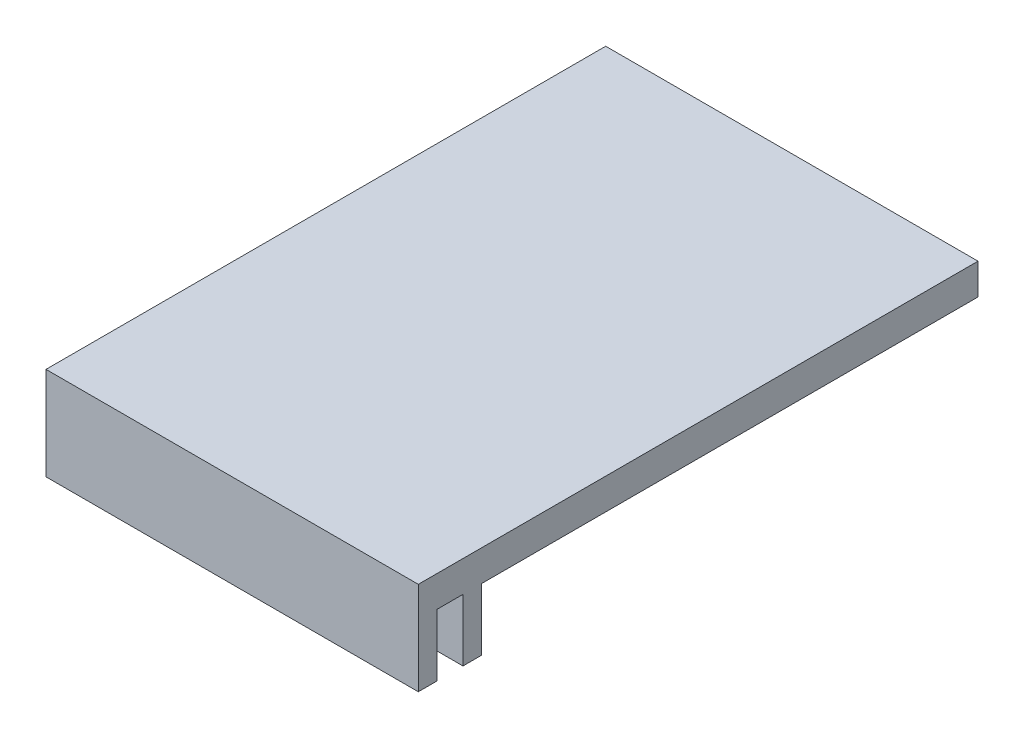
ISO-10303-21;
HEADER;
FILE_DESCRIPTION(('STEP AP214'),'2;1');
FILE_NAME('part.step','',(''),(''),'','','');
FILE_SCHEMA(('AUTOMOTIVE_DESIGN { 1 0 10303 214 1 1 1 1 }'));
ENDSEC;
DATA;
#1=APPLICATION_CONTEXT('core data for automotive mechanical design processes');
#2=APPLICATION_PROTOCOL_DEFINITION('international standard','automotive_design',2000,#1);
#3=PRODUCT_CONTEXT('',#1,'mechanical');
#4=PRODUCT('Part','Part','',(#3));
#5=PRODUCT_RELATED_PRODUCT_CATEGORY('part','',(#4));
#6=PRODUCT_DEFINITION_FORMATION('','',#4);
#7=PRODUCT_DEFINITION_CONTEXT('part definition',#1,'design');
#8=PRODUCT_DEFINITION('design','',#6,#7);
#9=PRODUCT_DEFINITION_SHAPE('','',#8);
#10=(LENGTH_UNIT() NAMED_UNIT(*) SI_UNIT(.MILLI.,.METRE.));
#11=(NAMED_UNIT(*) PLANE_ANGLE_UNIT() SI_UNIT($,.RADIAN.));
#12=(NAMED_UNIT(*) SI_UNIT($,.STERADIAN.) SOLID_ANGLE_UNIT());
#13=UNCERTAINTY_MEASURE_WITH_UNIT(LENGTH_MEASURE(1.E-05),#10,'distance_accuracy_value','');
#14=(GEOMETRIC_REPRESENTATION_CONTEXT(3) GLOBAL_UNCERTAINTY_ASSIGNED_CONTEXT((#13)) GLOBAL_UNIT_ASSIGNED_CONTEXT((#10,
#11,#12)) REPRESENTATION_CONTEXT('',''));
#15=CARTESIAN_POINT('',(0.,0.,0.));
#16=DIRECTION('',(0.,0.,1.));
#17=DIRECTION('',(1.,0.,0.));
#18=AXIS2_PLACEMENT_3D('',#15,#16,#17);
#19=CARTESIAN_POINT('',(0.,-10.,0.));
#20=DIRECTION('',(0.,-1.,0.));
#21=DIRECTION('',(0.,0.,-1.));
#22=AXIS2_PLACEMENT_3D('',#19,#20,#21);
#23=PLANE('',#22);
#24=DIRECTION('',(1.,0.,0.));
#25=VECTOR('',#24,1.);
#26=CARTESIAN_POINT('',(20.,-10.,3.));
#27=LINE('',#26,#25);
#28=CARTESIAN_POINT('',(-40.,-10.,2.99999999999999));
#29=VERTEX_POINT('',#28);
#30=CARTESIAN_POINT('',(20.,-10.,3.));
#31=VERTEX_POINT('',#30);
#32=EDGE_CURVE('E162',#29,#31,#27,.T.);
#33=ORIENTED_EDGE('',*,*,#32,.F.);
#34=DIRECTION('',(0.,0.,1.));
#35=VECTOR('',#34,1.);
#36=CARTESIAN_POINT('',(-40.,-10.,0.));
#37=LINE('',#36,#35);
#38=CARTESIAN_POINT('',(-40.,-10.,0.));
#39=VERTEX_POINT('',#38);
#40=EDGE_CURVE('E159',#39,#29,#37,.T.);
#41=ORIENTED_EDGE('',*,*,#40,.F.);
#42=DIRECTION('',(1.,0.,0.));
#43=VECTOR('',#42,1.);
#44=CARTESIAN_POINT('',(20.,-10.,0.));
#45=LINE('',#44,#43);
#46=CARTESIAN_POINT('',(20.,-10.,0.));
#47=VERTEX_POINT('',#46);
#48=EDGE_CURVE('E177',#39,#47,#45,.T.);
#49=ORIENTED_EDGE('',*,*,#48,.T.);
#50=DIRECTION('',(0.,0.,1.));
#51=VECTOR('',#50,1.);
#52=CARTESIAN_POINT('',(20.,-10.,0.));
#53=LINE('',#52,#51);
#54=EDGE_CURVE('E172',#47,#31,#53,.T.);
#55=ORIENTED_EDGE('',*,*,#54,.T.);
#56=EDGE_LOOP('',(#33,#41,#49,#55));
#57=FACE_BOUND('',#56,.T.);
#58=ADVANCED_FACE('F40',(#57),#23,.T.);
#59=CARTESIAN_POINT('',(20.,5.,0.));
#60=DIRECTION('',(-1.,0.,0.));
#61=DIRECTION('',(0.,0.,1.));
#62=AXIS2_PLACEMENT_3D('',#59,#60,#61);
#63=PLANE('',#62);
#64=DIRECTION('',(0.,0.,1.));
#65=VECTOR('',#64,1.);
#66=CARTESIAN_POINT('',(20.,0.,7.2));
#67=LINE('',#66,#65);
#68=CARTESIAN_POINT('',(20.,0.,3.));
#69=VERTEX_POINT('',#68);
#70=CARTESIAN_POINT('',(20.,0.,7.2));
#71=VERTEX_POINT('',#70);
#72=EDGE_CURVE('E123',#69,#71,#67,.T.);
#73=ORIENTED_EDGE('',*,*,#72,.F.);
#74=DIRECTION('',(0.,-1.,0.));
#75=VECTOR('',#74,1.);
#76=CARTESIAN_POINT('',(20.,0.,3.));
#77=LINE('',#76,#75);
#78=EDGE_CURVE('E167',#69,#31,#77,.T.);
#79=ORIENTED_EDGE('',*,*,#78,.T.);
#80=ORIENTED_EDGE('',*,*,#54,.F.);
#81=DIRECTION('',(0.,-1.,0.));
#82=VECTOR('',#81,1.);
#83=CARTESIAN_POINT('',(20.,5.,0.));
#84=LINE('',#83,#82);
#85=CARTESIAN_POINT('',(20.,0.,0.));
#86=VERTEX_POINT('',#85);
#87=EDGE_CURVE('E183',#86,#47,#84,.T.);
#88=ORIENTED_EDGE('',*,*,#87,.F.);
#89=DIRECTION('',(0.,0.,-1.));
#90=VECTOR('',#89,1.);
#91=CARTESIAN_POINT('',(20.,0.,0.));
#92=LINE('',#91,#90);
#93=CARTESIAN_POINT('',(20.,0.,-80.));
#94=VERTEX_POINT('',#93);
#95=EDGE_CURVE('E193',#86,#94,#92,.T.);
#96=ORIENTED_EDGE('',*,*,#95,.T.);
#97=DIRECTION('',(0.,-1.,0.));
#98=VECTOR('',#97,1.);
#99=CARTESIAN_POINT('',(20.,5.,-80.));
#100=LINE('',#99,#98);
#101=CARTESIAN_POINT('',(20.,5.,-80.));
#102=VERTEX_POINT('',#101);
#103=EDGE_CURVE('E11',#102,#94,#100,.T.);
#104=ORIENTED_EDGE('',*,*,#103,.F.);
#105=DIRECTION('',(0.,0.,-1.));
#106=VECTOR('',#105,1.);
#107=CARTESIAN_POINT('',(20.,5.,0.));
#108=LINE('',#107,#106);
#109=CARTESIAN_POINT('',(20.,5.,10.2));
#110=VERTEX_POINT('',#109);
#111=EDGE_CURVE('E64',#110,#102,#108,.T.);
#112=ORIENTED_EDGE('',*,*,#111,.F.);
#113=DIRECTION('',(0.,-1.,0.));
#114=VECTOR('',#113,1.);
#115=CARTESIAN_POINT('',(20.,5.,10.2));
#116=LINE('',#115,#114);
#117=CARTESIAN_POINT('',(20.,-10.,10.2));
#118=VERTEX_POINT('',#117);
#119=EDGE_CURVE('E182',#110,#118,#116,.T.);
#120=ORIENTED_EDGE('',*,*,#119,.T.);
#121=CARTESIAN_POINT('',(20.,-10.,7.2));
#122=VERTEX_POINT('',#121);
#123=EDGE_CURVE('E170',#122,#118,#53,.T.);
#124=ORIENTED_EDGE('',*,*,#123,.F.);
#125=DIRECTION('',(0.,-1.,0.));
#126=VECTOR('',#125,1.);
#127=CARTESIAN_POINT('',(20.,0.,7.2));
#128=LINE('',#127,#126);
#129=EDGE_CURVE('E55',#71,#122,#128,.T.);
#130=ORIENTED_EDGE('',*,*,#129,.F.);
#131=EDGE_LOOP('',(#73,#79,#80,#88,#96,#104,#112,#120,#124,#130));
#132=FACE_BOUND('',#131,.T.);
#133=ADVANCED_FACE('F42',(#132),#63,.F.);
#134=CARTESIAN_POINT('',(0.,5.,-80.));
#135=DIRECTION('',(0.,0.,1.));
#136=DIRECTION('',(1.,0.,0.));
#137=AXIS2_PLACEMENT_3D('',#134,#135,#136);
#138=PLANE('',#137);
#139=DIRECTION('',(-1.,0.,0.));
#140=VECTOR('',#139,1.);
#141=CARTESIAN_POINT('',(0.,0.,-80.));
#142=LINE('',#141,#140);
#143=CARTESIAN_POINT('',(-40.,0.,-80.));
#144=VERTEX_POINT('',#143);
#145=EDGE_CURVE('E189',#94,#144,#142,.T.);
#146=ORIENTED_EDGE('',*,*,#145,.T.);
#147=DIRECTION('',(0.,-1.,0.));
#148=VECTOR('',#147,1.);
#149=CARTESIAN_POINT('',(-40.,0.,-80.));
#150=LINE('',#149,#148);
#151=CARTESIAN_POINT('',(-40.,5.,-80.));
#152=VERTEX_POINT('',#151);
#153=EDGE_CURVE('E150',#152,#144,#150,.T.);
#154=ORIENTED_EDGE('',*,*,#153,.F.);
#155=DIRECTION('',(-1.,0.,0.));
#156=VECTOR('',#155,1.);
#157=CARTESIAN_POINT('',(0.,5.,-80.));
#158=LINE('',#157,#156);
#159=EDGE_CURVE('E48',#102,#152,#158,.T.);
#160=ORIENTED_EDGE('',*,*,#159,.F.);
#161=ORIENTED_EDGE('',*,*,#103,.T.);
#162=EDGE_LOOP('',(#146,#154,#160,#161));
#163=FACE_BOUND('',#162,.T.);
#164=ADVANCED_FACE('F197',(#163),#138,.F.);
#165=CARTESIAN_POINT('',(0.,5.,0.));
#166=DIRECTION('',(0.,-1.,0.));
#167=DIRECTION('',(0.,0.,-1.));
#168=AXIS2_PLACEMENT_3D('',#165,#166,#167);
#169=PLANE('',#168);
#170=ORIENTED_EDGE('',*,*,#159,.T.);
#171=DIRECTION('',(0.,0.,-1.));
#172=VECTOR('',#171,1.);
#173=CARTESIAN_POINT('',(-40.,5.,0.));
#174=LINE('',#173,#172);
#175=CARTESIAN_POINT('',(-40.,5.,10.2));
#176=VERTEX_POINT('',#175);
#177=EDGE_CURVE('E147',#176,#152,#174,.T.);
#178=ORIENTED_EDGE('',*,*,#177,.F.);
#179=DIRECTION('',(-1.,0.,0.));
#180=VECTOR('',#179,1.);
#181=CARTESIAN_POINT('',(20.,5.,10.2));
#182=LINE('',#181,#180);
#183=EDGE_CURVE('E180',#110,#176,#182,.T.);
#184=ORIENTED_EDGE('',*,*,#183,.F.);
#185=ORIENTED_EDGE('',*,*,#111,.T.);
#186=EDGE_LOOP('',(#170,#178,#184,#185));
#187=FACE_BOUND('',#186,.T.);
#188=ADVANCED_FACE('F221',(#187),#169,.F.);
#189=CARTESIAN_POINT('',(0.,0.,0.));
#190=DIRECTION('',(0.,-1.,0.));
#191=DIRECTION('',(0.,0.,-1.));
#192=AXIS2_PLACEMENT_3D('',#189,#190,#191);
#193=PLANE('',#192);
#194=DIRECTION('',(1.,0.,0.));
#195=VECTOR('',#194,1.);
#196=CARTESIAN_POINT('',(0.,0.,0.));
#197=LINE('',#196,#195);
#198=CARTESIAN_POINT('',(-40.,0.,0.));
#199=VERTEX_POINT('',#198);
#200=EDGE_CURVE('E185',#199,#86,#197,.T.);
#201=ORIENTED_EDGE('',*,*,#200,.F.);
#202=DIRECTION('',(0.,0.,1.));
#203=VECTOR('',#202,1.);
#204=CARTESIAN_POINT('',(-40.,0.,0.));
#205=LINE('',#204,#203);
#206=EDGE_CURVE('E153',#144,#199,#205,.T.);
#207=ORIENTED_EDGE('',*,*,#206,.F.);
#208=ORIENTED_EDGE('',*,*,#145,.F.);
#209=ORIENTED_EDGE('',*,*,#95,.F.);
#210=EDGE_LOOP('',(#201,#207,#208,#209));
#211=FACE_BOUND('',#210,.T.);
#212=ADVANCED_FACE('F203',(#211),#193,.T.);
#213=CARTESIAN_POINT('',(20.,5.,0.));
#214=DIRECTION('',(0.,0.,-1.));
#215=DIRECTION('',(-1.,0.,0.));
#216=AXIS2_PLACEMENT_3D('',#213,#214,#215);
#217=PLANE('',#216);
#218=ORIENTED_EDGE('',*,*,#48,.F.);
#219=DIRECTION('',(0.,-1.,0.));
#220=VECTOR('',#219,1.);
#221=CARTESIAN_POINT('',(-40.,0.,0.));
#222=LINE('',#221,#220);
#223=EDGE_CURVE('E156',#199,#39,#222,.T.);
#224=ORIENTED_EDGE('',*,*,#223,.F.);
#225=ORIENTED_EDGE('',*,*,#200,.T.);
#226=ORIENTED_EDGE('',*,*,#87,.T.);
#227=EDGE_LOOP('',(#218,#224,#225,#226));
#228=FACE_BOUND('',#227,.T.);
#229=ADVANCED_FACE('F206',(#228),#217,.T.);
#230=CARTESIAN_POINT('',(20.,5.,10.2));
#231=DIRECTION('',(0.,0.,1.));
#232=DIRECTION('',(1.,0.,0.));
#233=AXIS2_PLACEMENT_3D('',#230,#231,#232);
#234=PLANE('',#233);
#235=ORIENTED_EDGE('',*,*,#183,.T.);
#236=DIRECTION('',(0.,1.,0.));
#237=VECTOR('',#236,1.);
#238=CARTESIAN_POINT('',(-40.,0.,10.2));
#239=LINE('',#238,#237);
#240=CARTESIAN_POINT('',(-40.,-10.,10.2));
#241=VERTEX_POINT('',#240);
#242=EDGE_CURVE('E142',#241,#176,#239,.T.);
#243=ORIENTED_EDGE('',*,*,#242,.F.);
#244=DIRECTION('',(-1.,0.,0.));
#245=VECTOR('',#244,1.);
#246=CARTESIAN_POINT('',(20.,-10.,10.2));
#247=LINE('',#246,#245);
#248=EDGE_CURVE('E175',#118,#241,#247,.T.);
#249=ORIENTED_EDGE('',*,*,#248,.F.);
#250=ORIENTED_EDGE('',*,*,#119,.F.);
#251=EDGE_LOOP('',(#235,#243,#249,#250));
#252=FACE_BOUND('',#251,.T.);
#253=ADVANCED_FACE('F220',(#252),#234,.T.);
#254=DIRECTION('',(-1.,0.,0.));
#255=VECTOR('',#254,1.);
#256=CARTESIAN_POINT('',(20.,-10.,7.2));
#257=LINE('',#256,#255);
#258=CARTESIAN_POINT('',(-40.,-10.,7.2));
#259=VERTEX_POINT('',#258);
#260=EDGE_CURVE('E138',#122,#259,#257,.T.);
#261=ORIENTED_EDGE('',*,*,#260,.F.);
#262=ORIENTED_EDGE('',*,*,#123,.T.);
#263=ORIENTED_EDGE('',*,*,#248,.T.);
#264=DIRECTION('',(0.,0.,1.));
#265=VECTOR('',#264,1.);
#266=CARTESIAN_POINT('',(-40.,-10.,0.));
#267=LINE('',#266,#265);
#268=EDGE_CURVE('E140',#259,#241,#267,.T.);
#269=ORIENTED_EDGE('',*,*,#268,.F.);
#270=EDGE_LOOP('',(#261,#262,#263,#269));
#271=FACE_BOUND('',#270,.T.);
#272=ADVANCED_FACE('F217',(#271),#23,.T.);
#273=CARTESIAN_POINT('',(20.,0.,3.));
#274=DIRECTION('',(0.,0.,-1.));
#275=DIRECTION('',(-1.,0.,0.));
#276=AXIS2_PLACEMENT_3D('',#273,#274,#275);
#277=PLANE('',#276);
#278=ORIENTED_EDGE('',*,*,#32,.T.);
#279=ORIENTED_EDGE('',*,*,#78,.F.);
#280=DIRECTION('',(1.,0.,0.));
#281=VECTOR('',#280,1.);
#282=CARTESIAN_POINT('',(20.,0.,3.));
#283=LINE('',#282,#281);
#284=CARTESIAN_POINT('',(-40.,0.,2.99999999999999));
#285=VERTEX_POINT('',#284);
#286=EDGE_CURVE('E125',#285,#69,#283,.T.);
#287=ORIENTED_EDGE('',*,*,#286,.F.);
#288=DIRECTION('',(0.,1.,0.));
#289=VECTOR('',#288,1.);
#290=CARTESIAN_POINT('',(-40.,0.,2.99999999999999));
#291=LINE('',#290,#289);
#292=EDGE_CURVE('E135',#29,#285,#291,.T.);
#293=ORIENTED_EDGE('',*,*,#292,.F.);
#294=EDGE_LOOP('',(#278,#279,#287,#293));
#295=FACE_BOUND('',#294,.T.);
#296=ADVANCED_FACE('F212',(#295),#277,.F.);
#297=CARTESIAN_POINT('',(20.,0.,7.2));
#298=DIRECTION('',(0.,0.,1.));
#299=DIRECTION('',(1.,0.,0.));
#300=AXIS2_PLACEMENT_3D('',#297,#298,#299);
#301=PLANE('',#300);
#302=ORIENTED_EDGE('',*,*,#260,.T.);
#303=DIRECTION('',(0.,1.,0.));
#304=VECTOR('',#303,1.);
#305=CARTESIAN_POINT('',(-40.,0.,7.2));
#306=LINE('',#305,#304);
#307=CARTESIAN_POINT('',(-40.,0.,7.2));
#308=VERTEX_POINT('',#307);
#309=EDGE_CURVE('E132',#259,#308,#306,.T.);
#310=ORIENTED_EDGE('',*,*,#309,.T.);
#311=DIRECTION('',(-1.,0.,0.));
#312=VECTOR('',#311,1.);
#313=CARTESIAN_POINT('',(20.,0.,7.2));
#314=LINE('',#313,#312);
#315=EDGE_CURVE('E117',#71,#308,#314,.T.);
#316=ORIENTED_EDGE('',*,*,#315,.F.);
#317=ORIENTED_EDGE('',*,*,#129,.T.);
#318=EDGE_LOOP('',(#302,#310,#316,#317));
#319=FACE_BOUND('',#318,.T.);
#320=ADVANCED_FACE('F137',(#319),#301,.F.);
#321=CARTESIAN_POINT('',(0.,0.,0.));
#322=DIRECTION('',(0.,1.,0.));
#323=DIRECTION('',(0.,0.,1.));
#324=AXIS2_PLACEMENT_3D('',#321,#322,#323);
#325=PLANE('',#324);
#326=ORIENTED_EDGE('',*,*,#72,.T.);
#327=ORIENTED_EDGE('',*,*,#315,.T.);
#328=DIRECTION('',(0.,0.,1.));
#329=VECTOR('',#328,1.);
#330=CARTESIAN_POINT('',(-40.,0.,0.));
#331=LINE('',#330,#329);
#332=EDGE_CURVE('E121',#285,#308,#331,.T.);
#333=ORIENTED_EDGE('',*,*,#332,.F.);
#334=ORIENTED_EDGE('',*,*,#286,.T.);
#335=EDGE_LOOP('',(#326,#327,#333,#334));
#336=FACE_BOUND('',#335,.T.);
#337=ADVANCED_FACE('F119',(#336),#325,.F.);
#338=CARTESIAN_POINT('',(-40.,0.,0.));
#339=DIRECTION('',(-1.,0.,0.));
#340=DIRECTION('',(0.,0.,1.));
#341=AXIS2_PLACEMENT_3D('',#338,#339,#340);
#342=PLANE('',#341);
#343=ORIENTED_EDGE('',*,*,#332,.T.);
#344=ORIENTED_EDGE('',*,*,#309,.F.);
#345=ORIENTED_EDGE('',*,*,#268,.T.);
#346=ORIENTED_EDGE('',*,*,#242,.T.);
#347=ORIENTED_EDGE('',*,*,#177,.T.);
#348=ORIENTED_EDGE('',*,*,#153,.T.);
#349=ORIENTED_EDGE('',*,*,#206,.T.);
#350=ORIENTED_EDGE('',*,*,#223,.T.);
#351=ORIENTED_EDGE('',*,*,#40,.T.);
#352=ORIENTED_EDGE('',*,*,#292,.T.);
#353=EDGE_LOOP('',(#343,#344,#345,#346,#347,#348,#349,#350,#351,#352));
#354=FACE_BOUND('',#353,.T.);
#355=ADVANCED_FACE('F130',(#354),#342,.T.);
#356=CLOSED_SHELL('',(#58,#133,#164,#188,#212,#229,#253,#272,#296,#320,#337,#355));
#357=MANIFOLD_SOLID_BREP('B2',#356);
#358=ADVANCED_BREP_SHAPE_REPRESENTATION('',(#18,#357),#14);
#359=SHAPE_DEFINITION_REPRESENTATION(#9,#358);
ENDSEC;
END-ISO-10303-21;
